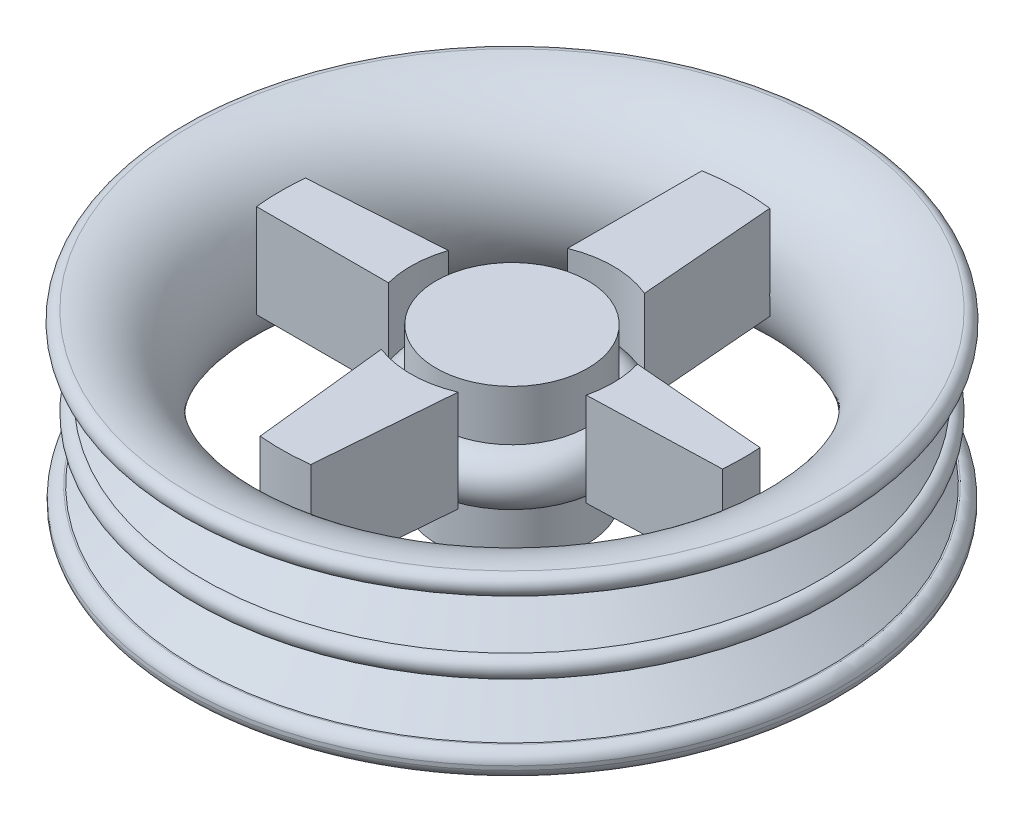
ISO-10303-21;
HEADER;
FILE_DESCRIPTION(('STEP AP214'),'2;1');
FILE_NAME('part.step','',(''),(''),'','','');
FILE_SCHEMA(('AUTOMOTIVE_DESIGN { 1 0 10303 214 1 1 1 1 }'));
ENDSEC;
DATA;
#1=APPLICATION_CONTEXT('core data for automotive mechanical design processes');
#2=APPLICATION_PROTOCOL_DEFINITION('international standard','automotive_design',2000,#1);
#3=PRODUCT_CONTEXT('',#1,'mechanical');
#4=PRODUCT('Part','Part','',(#3));
#5=PRODUCT_RELATED_PRODUCT_CATEGORY('part','',(#4));
#6=PRODUCT_DEFINITION_FORMATION('','',#4);
#7=PRODUCT_DEFINITION_CONTEXT('part definition',#1,'design');
#8=PRODUCT_DEFINITION('design','',#6,#7);
#9=PRODUCT_DEFINITION_SHAPE('','',#8);
#10=(LENGTH_UNIT() NAMED_UNIT(*) SI_UNIT(.MILLI.,.METRE.));
#11=(NAMED_UNIT(*) PLANE_ANGLE_UNIT() SI_UNIT($,.RADIAN.));
#12=(NAMED_UNIT(*) SI_UNIT($,.STERADIAN.) SOLID_ANGLE_UNIT());
#13=UNCERTAINTY_MEASURE_WITH_UNIT(LENGTH_MEASURE(1.E-05),#10,'distance_accuracy_value','');
#14=(GEOMETRIC_REPRESENTATION_CONTEXT(3) GLOBAL_UNCERTAINTY_ASSIGNED_CONTEXT((#13)) GLOBAL_UNIT_ASSIGNED_CONTEXT((#10,
#11,#12)) REPRESENTATION_CONTEXT('',''));
#15=CARTESIAN_POINT('',(0.,0.,0.));
#16=DIRECTION('',(0.,0.,1.));
#17=DIRECTION('',(1.,0.,0.));
#18=AXIS2_PLACEMENT_3D('',#15,#16,#17);
#19=CARTESIAN_POINT('',(0.,23.,0.));
#20=DIRECTION('',(0.,1.,0.));
#21=DIRECTION('',(0.,0.,1.));
#22=AXIS2_PLACEMENT_3D('',#19,#20,#21);
#23=CYLINDRICAL_SURFACE('',#22,91.4589113328219);
#24=CARTESIAN_POINT('',(0.,60.,0.));
#25=DIRECTION('',(0.,1.,0.));
#26=DIRECTION('',(0.,0.,1.));
#27=AXIS2_PLACEMENT_3D('',#24,#25,#26);
#28=CIRCLE('',#27,91.4589113328219);
#29=CARTESIAN_POINT('',(-90.9831737277375,60.,-9.31635983704523));
#30=VERTEX_POINT('',#29);
#31=CARTESIAN_POINT('',(-90.8946628008445,60.,10.1436056954988));
#32=VERTEX_POINT('',#31);
#33=EDGE_CURVE('E111',#30,#32,#28,.T.);
#34=ORIENTED_EDGE('',*,*,#33,.F.);
#35=DIRECTION('',(0.,1.,0.));
#36=VECTOR('',#35,1.);
#37=CARTESIAN_POINT('',(-90.9831737277375,23.,-9.31635983704523));
#38=LINE('',#37,#36);
#39=CARTESIAN_POINT('',(-90.9831737277375,23.,-9.31635983704523));
#40=VERTEX_POINT('',#39);
#41=EDGE_CURVE('E12',#40,#30,#38,.T.);
#42=ORIENTED_EDGE('',*,*,#41,.F.);
#43=CARTESIAN_POINT('',(0.,23.,0.));
#44=DIRECTION('',(0.,1.,0.));
#45=DIRECTION('',(0.,0.,1.));
#46=AXIS2_PLACEMENT_3D('',#43,#44,#45);
#47=CIRCLE('',#46,91.4589113328219);
#48=CARTESIAN_POINT('',(-90.8946628008445,23.,10.1436056954988));
#49=VERTEX_POINT('',#48);
#50=EDGE_CURVE('E106',#40,#49,#47,.T.);
#51=ORIENTED_EDGE('',*,*,#50,.T.);
#52=DIRECTION('',(0.,1.,0.));
#53=VECTOR('',#52,1.);
#54=CARTESIAN_POINT('',(-90.8946628008445,23.,10.1436056954988));
#55=LINE('',#54,#53);
#56=EDGE_CURVE('E49',#49,#32,#55,.T.);
#57=ORIENTED_EDGE('',*,*,#56,.T.);
#58=EDGE_LOOP('',(#34,#42,#51,#57));
#59=FACE_BOUND('',#58,.T.);
#60=ADVANCED_FACE('F46',(#59),#23,.T.);
#61=CARTESIAN_POINT('',(-90.9831737277375,23.,-9.31635983704523));
#62=DIRECTION('',(0.0648751614790877,0.,0.997893387804059));
#63=DIRECTION('',(0.997893387804059,0.,-0.0648751614790877));
#64=AXIS2_PLACEMENT_3D('',#61,#62,#63);
#65=PLANE('',#64);
#66=DIRECTION('',(0.997893387804059,0.,-0.0648751614790877));
#67=VECTOR('',#66,1.);
#68=CARTESIAN_POINT('',(-90.9831737277375,60.,-9.31635983704523));
#69=LINE('',#68,#67);
#70=CARTESIAN_POINT('',(-37.9078661653591,60.,-12.7668979313388));
#71=VERTEX_POINT('',#70);
#72=EDGE_CURVE('E79',#30,#71,#69,.T.);
#73=ORIENTED_EDGE('',*,*,#72,.T.);
#74=DIRECTION('',(0.,1.,0.));
#75=VECTOR('',#74,1.);
#76=CARTESIAN_POINT('',(-37.9078661653591,23.,-12.7668979313388));
#77=LINE('',#76,#75);
#78=CARTESIAN_POINT('',(-37.9078661653591,23.,-12.7668979313388));
#79=VERTEX_POINT('',#78);
#80=EDGE_CURVE('E55',#79,#71,#77,.T.);
#81=ORIENTED_EDGE('',*,*,#80,.F.);
#82=DIRECTION('',(0.997893387804059,0.,-0.0648751614790877));
#83=VECTOR('',#82,1.);
#84=CARTESIAN_POINT('',(-90.9831737277375,23.,-9.31635983704523));
#85=LINE('',#84,#83);
#86=EDGE_CURVE('E96',#40,#79,#85,.T.);
#87=ORIENTED_EDGE('',*,*,#86,.F.);
#88=ORIENTED_EDGE('',*,*,#41,.T.);
#89=EDGE_LOOP('',(#73,#81,#87,#88));
#90=FACE_BOUND('',#89,.T.);
#91=ADVANCED_FACE('F121',(#90),#65,.F.);
#92=CARTESIAN_POINT('',(0.,23.,0.));
#93=DIRECTION('',(0.,1.,0.));
#94=DIRECTION('',(0.,0.,1.));
#95=AXIS2_PLACEMENT_3D('',#92,#93,#94);
#96=CYLINDRICAL_SURFACE('',#95,40.);
#97=CARTESIAN_POINT('',(0.,60.,0.));
#98=DIRECTION('',(0.,1.,0.));
#99=DIRECTION('',(0.,0.,1.));
#100=AXIS2_PLACEMENT_3D('',#97,#98,#99);
#101=CIRCLE('',#100,40.);
#102=CARTESIAN_POINT('',(-38.6924703720794,60.,10.1436056954988));
#103=VERTEX_POINT('',#102);
#104=EDGE_CURVE('E103',#71,#103,#101,.T.);
#105=ORIENTED_EDGE('',*,*,#104,.T.);
#106=DIRECTION('',(0.,1.,0.));
#107=VECTOR('',#106,1.);
#108=CARTESIAN_POINT('',(-38.6924703720794,23.,10.1436056954988));
#109=LINE('',#108,#107);
#110=CARTESIAN_POINT('',(-38.6924703720794,23.,10.1436056954988));
#111=VERTEX_POINT('',#110);
#112=EDGE_CURVE('E100',#111,#103,#109,.T.);
#113=ORIENTED_EDGE('',*,*,#112,.F.);
#114=CARTESIAN_POINT('',(0.,23.,0.));
#115=DIRECTION('',(0.,1.,0.));
#116=DIRECTION('',(0.,0.,1.));
#117=AXIS2_PLACEMENT_3D('',#114,#115,#116);
#118=CIRCLE('',#117,40.);
#119=EDGE_CURVE('E91',#79,#111,#118,.T.);
#120=ORIENTED_EDGE('',*,*,#119,.F.);
#121=ORIENTED_EDGE('',*,*,#80,.T.);
#122=EDGE_LOOP('',(#105,#113,#120,#121));
#123=FACE_BOUND('',#122,.T.);
#124=ADVANCED_FACE('F101',(#123),#96,.F.);
#125=CARTESIAN_POINT('',(-90.8946628008445,23.,10.1436056954988));
#126=DIRECTION('',(0.,0.,1.));
#127=DIRECTION('',(1.,0.,0.));
#128=AXIS2_PLACEMENT_3D('',#125,#126,#127);
#129=PLANE('',#128);
#130=DIRECTION('',(1.,0.,0.));
#131=VECTOR('',#130,1.);
#132=CARTESIAN_POINT('',(-90.8946628008445,60.,10.1436056954988));
#133=LINE('',#132,#131);
#134=EDGE_CURVE('E114',#32,#103,#133,.T.);
#135=ORIENTED_EDGE('',*,*,#134,.F.);
#136=ORIENTED_EDGE('',*,*,#56,.F.);
#137=DIRECTION('',(1.,0.,0.));
#138=VECTOR('',#137,1.);
#139=CARTESIAN_POINT('',(-90.8946628008445,23.,10.1436056954988));
#140=LINE('',#139,#138);
#141=EDGE_CURVE('E95',#49,#111,#140,.T.);
#142=ORIENTED_EDGE('',*,*,#141,.T.);
#143=ORIENTED_EDGE('',*,*,#112,.T.);
#144=EDGE_LOOP('',(#135,#136,#142,#143));
#145=FACE_BOUND('',#144,.T.);
#146=ADVANCED_FACE('F105',(#145),#129,.T.);
#147=CARTESIAN_POINT('',(0.,23.,0.));
#148=DIRECTION('',(0.,1.,0.));
#149=DIRECTION('',(0.,0.,1.));
#150=AXIS2_PLACEMENT_3D('',#147,#148,#149);
#151=PLANE('',#150);
#152=ORIENTED_EDGE('',*,*,#50,.F.);
#153=ORIENTED_EDGE('',*,*,#86,.T.);
#154=ORIENTED_EDGE('',*,*,#119,.T.);
#155=ORIENTED_EDGE('',*,*,#141,.F.);
#156=EDGE_LOOP('',(#152,#153,#154,#155));
#157=FACE_BOUND('',#156,.T.);
#158=ADVANCED_FACE('F94',(#157),#151,.F.);
#159=CARTESIAN_POINT('',(0.,60.,0.));
#160=DIRECTION('',(0.,1.,0.));
#161=DIRECTION('',(0.,0.,1.));
#162=AXIS2_PLACEMENT_3D('',#159,#160,#161);
#163=PLANE('',#162);
#164=ORIENTED_EDGE('',*,*,#33,.T.);
#165=ORIENTED_EDGE('',*,*,#134,.T.);
#166=ORIENTED_EDGE('',*,*,#104,.F.);
#167=ORIENTED_EDGE('',*,*,#72,.F.);
#168=EDGE_LOOP('',(#164,#165,#166,#167));
#169=FACE_BOUND('',#168,.T.);
#170=ADVANCED_FACE('F119',(#169),#163,.T.);
#171=CLOSED_SHELL('',(#60,#91,#124,#146,#158,#170));
#172=MANIFOLD_SOLID_BREP('B2',#171);
#173=CARTESIAN_POINT('',(38.3931390808547,23.,-11.2234964034452));
#174=DIRECTION('',(-0.0820911920243517,0.,0.996624822183363));
#175=DIRECTION('',(0.996624822183364,0.,0.0820911920243518));
#176=AXIS2_PLACEMENT_3D('',#173,#174,#175);
#177=PLANE('',#176);
#178=DIRECTION('',(0.996624822183364,0.,0.0820911920243517));
#179=VECTOR('',#178,1.);
#180=CARTESIAN_POINT('',(38.3931390808547,60.,-11.2234964034452));
#181=LINE('',#180,#179);
#182=CARTESIAN_POINT('',(38.3931390808547,60.,-11.2234964034452));
#183=VERTEX_POINT('',#182);
#184=CARTESIAN_POINT('',(91.2002362359535,60.,-6.87381791228454));
#185=VERTEX_POINT('',#184);
#186=EDGE_CURVE('E242',#183,#185,#181,.T.);
#187=ORIENTED_EDGE('',*,*,#186,.T.);
#188=DIRECTION('',(0.,1.,0.));
#189=VECTOR('',#188,1.);
#190=CARTESIAN_POINT('',(91.2002362359535,23.,-6.87381791228454));
#191=LINE('',#190,#189);
#192=CARTESIAN_POINT('',(91.2002362359535,23.,-6.87381791228454));
#193=VERTEX_POINT('',#192);
#194=EDGE_CURVE('E44',#193,#185,#191,.T.);
#195=ORIENTED_EDGE('',*,*,#194,.F.);
#196=DIRECTION('',(0.996624822183364,0.,0.0820911920243517));
#197=VECTOR('',#196,1.);
#198=CARTESIAN_POINT('',(38.3931390808547,23.,-11.2234964034452));
#199=LINE('',#198,#197);
#200=CARTESIAN_POINT('',(38.3931390808547,23.,-11.2234964034452));
#201=VERTEX_POINT('',#200);
#202=EDGE_CURVE('E219',#201,#193,#199,.T.);
#203=ORIENTED_EDGE('',*,*,#202,.F.);
#204=DIRECTION('',(0.,1.,0.));
#205=VECTOR('',#204,1.);
#206=CARTESIAN_POINT('',(38.3931390808547,23.,-11.2234964034452));
#207=LINE('',#206,#205);
#208=EDGE_CURVE('E238',#201,#183,#207,.T.);
#209=ORIENTED_EDGE('',*,*,#208,.T.);
#210=EDGE_LOOP('',(#187,#195,#203,#209));
#211=FACE_BOUND('',#210,.T.);
#212=ADVANCED_FACE('F180',(#211),#177,.F.);
#213=CARTESIAN_POINT('',(0.,23.,0.));
#214=DIRECTION('',(0.,1.,0.));
#215=DIRECTION('',(0.,0.,1.));
#216=AXIS2_PLACEMENT_3D('',#213,#214,#215);
#217=CYLINDRICAL_SURFACE('',#216,91.4589113328219);
#218=CARTESIAN_POINT('',(0.,60.,0.));
#219=DIRECTION('',(0.,1.,0.));
#220=DIRECTION('',(0.,0.,1.));
#221=AXIS2_PLACEMENT_3D('',#218,#219,#220);
#222=CIRCLE('',#221,91.4589113328219);
#223=CARTESIAN_POINT('',(91.118189276814,60.,7.88720768711422));
#224=VERTEX_POINT('',#223);
#225=EDGE_CURVE('E228',#224,#185,#222,.T.);
#226=ORIENTED_EDGE('',*,*,#225,.F.);
#227=DIRECTION('',(0.,1.,0.));
#228=VECTOR('',#227,1.);
#229=CARTESIAN_POINT('',(91.118189276814,23.,7.88720768711422));
#230=LINE('',#229,#228);
#231=CARTESIAN_POINT('',(91.118189276814,23.,7.88720768711422));
#232=VERTEX_POINT('',#231);
#233=EDGE_CURVE('E188',#232,#224,#230,.T.);
#234=ORIENTED_EDGE('',*,*,#233,.F.);
#235=CARTESIAN_POINT('',(0.,23.,0.));
#236=DIRECTION('',(0.,1.,0.));
#237=DIRECTION('',(0.,0.,1.));
#238=AXIS2_PLACEMENT_3D('',#235,#236,#237);
#239=CIRCLE('',#238,91.4589113328219);
#240=EDGE_CURVE('E226',#232,#193,#239,.T.);
#241=ORIENTED_EDGE('',*,*,#240,.T.);
#242=ORIENTED_EDGE('',*,*,#194,.T.);
#243=EDGE_LOOP('',(#226,#234,#241,#242));
#244=FACE_BOUND('',#243,.T.);
#245=ADVANCED_FACE('F225',(#244),#217,.T.);
#246=CARTESIAN_POINT('',(38.8508563746418,23.,9.51897888205195));
#247=DIRECTION('',(0.0312045108396659,0.,0.999513020677198));
#248=DIRECTION('',(0.999513020677198,0.,-0.0312045108396659));
#249=AXIS2_PLACEMENT_3D('',#246,#247,#248);
#250=PLANE('',#249);
#251=DIRECTION('',(0.999513020677198,0.,-0.0312045108396659));
#252=VECTOR('',#251,1.);
#253=CARTESIAN_POINT('',(38.8508563746418,60.,9.51897888205195));
#254=LINE('',#253,#252);
#255=CARTESIAN_POINT('',(38.8508563746418,60.,9.51897888205195));
#256=VERTEX_POINT('',#255);
#257=EDGE_CURVE('E246',#256,#224,#254,.T.);
#258=ORIENTED_EDGE('',*,*,#257,.F.);
#259=DIRECTION('',(0.,1.,0.));
#260=VECTOR('',#259,1.);
#261=CARTESIAN_POINT('',(38.8508563746418,23.,9.51897888205195));
#262=LINE('',#261,#260);
#263=CARTESIAN_POINT('',(38.8508563746418,23.,9.51897888205195));
#264=VERTEX_POINT('',#263);
#265=EDGE_CURVE('E211',#264,#256,#262,.T.);
#266=ORIENTED_EDGE('',*,*,#265,.F.);
#267=DIRECTION('',(0.999513020677198,0.,-0.0312045108396659));
#268=VECTOR('',#267,1.);
#269=CARTESIAN_POINT('',(38.8508563746418,23.,9.51897888205195));
#270=LINE('',#269,#268);
#271=EDGE_CURVE('E234',#264,#232,#270,.T.);
#272=ORIENTED_EDGE('',*,*,#271,.T.);
#273=ORIENTED_EDGE('',*,*,#233,.T.);
#274=EDGE_LOOP('',(#258,#266,#272,#273));
#275=FACE_BOUND('',#274,.T.);
#276=ADVANCED_FACE('F236',(#275),#250,.T.);
#277=CARTESIAN_POINT('',(0.,23.,0.));
#278=DIRECTION('',(0.,1.,0.));
#279=DIRECTION('',(0.,0.,1.));
#280=AXIS2_PLACEMENT_3D('',#277,#278,#279);
#281=CYLINDRICAL_SURFACE('',#280,40.);
#282=CARTESIAN_POINT('',(0.,60.,0.));
#283=DIRECTION('',(0.,1.,0.));
#284=DIRECTION('',(0.,0.,1.));
#285=AXIS2_PLACEMENT_3D('',#282,#283,#284);
#286=CIRCLE('',#285,40.);
#287=EDGE_CURVE('E214',#256,#183,#286,.T.);
#288=ORIENTED_EDGE('',*,*,#287,.T.);
#289=ORIENTED_EDGE('',*,*,#208,.F.);
#290=CARTESIAN_POINT('',(0.,23.,0.));
#291=DIRECTION('',(0.,1.,0.));
#292=DIRECTION('',(0.,0.,1.));
#293=AXIS2_PLACEMENT_3D('',#290,#291,#292);
#294=CIRCLE('',#293,40.);
#295=EDGE_CURVE('E196',#264,#201,#294,.T.);
#296=ORIENTED_EDGE('',*,*,#295,.F.);
#297=ORIENTED_EDGE('',*,*,#265,.T.);
#298=EDGE_LOOP('',(#288,#289,#296,#297));
#299=FACE_BOUND('',#298,.T.);
#300=ADVANCED_FACE('F259',(#299),#281,.F.);
#301=CARTESIAN_POINT('',(0.,23.,0.));
#302=DIRECTION('',(0.,1.,0.));
#303=DIRECTION('',(0.,0.,1.));
#304=AXIS2_PLACEMENT_3D('',#301,#302,#303);
#305=PLANE('',#304);
#306=ORIENTED_EDGE('',*,*,#202,.T.);
#307=ORIENTED_EDGE('',*,*,#240,.F.);
#308=ORIENTED_EDGE('',*,*,#271,.F.);
#309=ORIENTED_EDGE('',*,*,#295,.T.);
#310=EDGE_LOOP('',(#306,#307,#308,#309));
#311=FACE_BOUND('',#310,.T.);
#312=ADVANCED_FACE('F233',(#311),#305,.F.);
#313=CARTESIAN_POINT('',(0.,60.,0.));
#314=DIRECTION('',(0.,1.,0.));
#315=DIRECTION('',(0.,0.,1.));
#316=AXIS2_PLACEMENT_3D('',#313,#314,#315);
#317=PLANE('',#316);
#318=ORIENTED_EDGE('',*,*,#186,.F.);
#319=ORIENTED_EDGE('',*,*,#287,.F.);
#320=ORIENTED_EDGE('',*,*,#257,.T.);
#321=ORIENTED_EDGE('',*,*,#225,.T.);
#322=EDGE_LOOP('',(#318,#319,#320,#321));
#323=FACE_BOUND('',#322,.T.);
#324=ADVANCED_FACE('F253',(#323),#317,.T.);
#325=CLOSED_SHELL('',(#212,#245,#276,#300,#312,#324));
#326=MANIFOLD_SOLID_BREP('B6',#325);
#327=CARTESIAN_POINT('',(0.,63.,0.));
#328=DIRECTION('',(0.,-1.,0.));
#329=DIRECTION('',(0.,0.,-1.));
#330=AXIS2_PLACEMENT_3D('',#327,#328,#329);
#331=CYLINDRICAL_SURFACE('',#330,40.);
#332=DIRECTION('',(0.,-1.,0.));
#333=VECTOR('',#332,1.);
#334=CARTESIAN_POINT('',(15.5278062635002,63.,36.8630876710457));
#335=LINE('',#334,#333);
#336=CARTESIAN_POINT('',(15.5278062635002,63.,36.8630876710457));
#337=VERTEX_POINT('',#336);
#338=CARTESIAN_POINT('',(15.5278062635002,23.,36.8630876710457));
#339=VERTEX_POINT('',#338);
#340=EDGE_CURVE('E317',#337,#339,#335,.T.);
#341=ORIENTED_EDGE('',*,*,#340,.T.);
#342=CARTESIAN_POINT('',(0.,23.,0.));
#343=DIRECTION('',(0.,1.,0.));
#344=DIRECTION('',(0.,0.,1.));
#345=AXIS2_PLACEMENT_3D('',#342,#343,#344);
#346=CIRCLE('',#345,40.);
#347=CARTESIAN_POINT('',(-14.341098737347,23.,37.3407670918216));
#348=VERTEX_POINT('',#347);
#349=EDGE_CURVE('E354',#348,#339,#346,.T.);
#350=ORIENTED_EDGE('',*,*,#349,.F.);
#351=DIRECTION('',(0.,-1.,0.));
#352=VECTOR('',#351,1.);
#353=CARTESIAN_POINT('',(-14.341098737347,63.,37.3407670918216));
#354=LINE('',#353,#352);
#355=CARTESIAN_POINT('',(-14.341098737347,63.,37.3407670918216));
#356=VERTEX_POINT('',#355);
#357=EDGE_CURVE('E178',#356,#348,#354,.T.);
#358=ORIENTED_EDGE('',*,*,#357,.F.);
#359=CARTESIAN_POINT('',(0.,63.,0.));
#360=DIRECTION('',(0.,1.,0.));
#361=DIRECTION('',(0.,0.,1.));
#362=AXIS2_PLACEMENT_3D('',#359,#360,#361);
#363=CIRCLE('',#362,40.);
#364=EDGE_CURVE('E356',#356,#337,#363,.T.);
#365=ORIENTED_EDGE('',*,*,#364,.T.);
#366=EDGE_LOOP('',(#341,#350,#358,#365));
#367=FACE_BOUND('',#366,.T.);
#368=ADVANCED_FACE('F314',(#367),#331,.F.);
#369=CARTESIAN_POINT('',(-14.341098737347,63.,37.3407670918216));
#370=DIRECTION('',(0.994229006561783,0.,-0.107278527726524));
#371=DIRECTION('',(-0.107278527726524,0.,-0.994229006561783));
#372=AXIS2_PLACEMENT_3D('',#369,#370,#371);
#373=PLANE('',#372);
#374=ORIENTED_EDGE('',*,*,#357,.T.);
#375=DIRECTION('',(0.107278527726524,0.,0.994229006561783));
#376=VECTOR('',#375,1.);
#377=CARTESIAN_POINT('',(-14.341098737347,23.,37.3407670918216));
#378=LINE('',#377,#376);
#379=CARTESIAN_POINT('',(-8.54484950903178,23.,91.0588711167285));
#380=VERTEX_POINT('',#379);
#381=EDGE_CURVE('E372',#348,#380,#378,.T.);
#382=ORIENTED_EDGE('',*,*,#381,.T.);
#383=DIRECTION('',(0.,-1.,0.));
#384=VECTOR('',#383,1.);
#385=CARTESIAN_POINT('',(-8.54484950903178,63.,91.0588711167285));
#386=LINE('',#385,#384);
#387=CARTESIAN_POINT('',(-8.54484950903178,63.,91.0588711167285));
#388=VERTEX_POINT('',#387);
#389=EDGE_CURVE('E322',#388,#380,#386,.T.);
#390=ORIENTED_EDGE('',*,*,#389,.F.);
#391=DIRECTION('',(0.107278527726524,0.,0.994229006561783));
#392=VECTOR('',#391,1.);
#393=CARTESIAN_POINT('',(-14.341098737347,63.,37.3407670918216));
#394=LINE('',#393,#392);
#395=EDGE_CURVE('E335',#356,#388,#394,.T.);
#396=ORIENTED_EDGE('',*,*,#395,.F.);
#397=EDGE_LOOP('',(#374,#382,#390,#396));
#398=FACE_BOUND('',#397,.T.);
#399=ADVANCED_FACE('F387',(#398),#373,.F.);
#400=CARTESIAN_POINT('',(0.,63.,0.));
#401=DIRECTION('',(0.,-1.,0.));
#402=DIRECTION('',(0.,0.,-1.));
#403=AXIS2_PLACEMENT_3D('',#400,#401,#402);
#404=CYLINDRICAL_SURFACE('',#403,91.4589113328219);
#405=ORIENTED_EDGE('',*,*,#389,.T.);
#406=CARTESIAN_POINT('',(0.,23.,0.));
#407=DIRECTION('',(0.,1.,0.));
#408=DIRECTION('',(0.,0.,1.));
#409=AXIS2_PLACEMENT_3D('',#406,#407,#408);
#410=CIRCLE('',#409,91.4589113328219);
#411=CARTESIAN_POINT('',(11.1882063196708,23.,90.7720028507329));
#412=VERTEX_POINT('',#411);
#413=EDGE_CURVE('E368',#380,#412,#410,.T.);
#414=ORIENTED_EDGE('',*,*,#413,.T.);
#415=DIRECTION('',(0.,-1.,0.));
#416=VECTOR('',#415,1.);
#417=CARTESIAN_POINT('',(11.1882063196708,63.,90.7720028507329));
#418=LINE('',#417,#416);
#419=CARTESIAN_POINT('',(11.1882063196708,63.,90.7720028507329));
#420=VERTEX_POINT('',#419);
#421=EDGE_CURVE('E360',#420,#412,#418,.T.);
#422=ORIENTED_EDGE('',*,*,#421,.F.);
#423=CARTESIAN_POINT('',(0.,63.,0.));
#424=DIRECTION('',(0.,1.,0.));
#425=DIRECTION('',(0.,0.,1.));
#426=AXIS2_PLACEMENT_3D('',#423,#424,#425);
#427=CIRCLE('',#426,91.4589113328219);
#428=EDGE_CURVE('E380',#388,#420,#427,.T.);
#429=ORIENTED_EDGE('',*,*,#428,.F.);
#430=EDGE_LOOP('',(#405,#414,#422,#429));
#431=FACE_BOUND('',#430,.T.);
#432=ADVANCED_FACE('F385',(#431),#404,.T.);
#433=CARTESIAN_POINT('',(15.5278062635002,63.,36.8630876710457));
#434=DIRECTION('',(0.996775638213766,0.,0.0802391865832404));
#435=DIRECTION('',(0.0802391865832404,0.,-0.996775638213766));
#436=AXIS2_PLACEMENT_3D('',#433,#434,#435);
#437=PLANE('',#436);
#438=ORIENTED_EDGE('',*,*,#421,.T.);
#439=DIRECTION('',(-0.0802391865832404,0.,0.996775638213766));
#440=VECTOR('',#439,1.);
#441=CARTESIAN_POINT('',(15.5278062635002,23.,36.8630876710457));
#442=LINE('',#441,#440);
#443=EDGE_CURVE('E362',#339,#412,#442,.T.);
#444=ORIENTED_EDGE('',*,*,#443,.F.);
#445=ORIENTED_EDGE('',*,*,#340,.F.);
#446=DIRECTION('',(-0.0802391865832404,0.,0.996775638213766));
#447=VECTOR('',#446,1.);
#448=CARTESIAN_POINT('',(15.5278062635002,63.,36.8630876710457));
#449=LINE('',#448,#447);
#450=EDGE_CURVE('E378',#337,#420,#449,.T.);
#451=ORIENTED_EDGE('',*,*,#450,.T.);
#452=EDGE_LOOP('',(#438,#444,#445,#451));
#453=FACE_BOUND('',#452,.T.);
#454=ADVANCED_FACE('F363',(#453),#437,.T.);
#455=CARTESIAN_POINT('',(0.,63.,0.));
#456=DIRECTION('',(0.,1.,0.));
#457=DIRECTION('',(0.,0.,1.));
#458=AXIS2_PLACEMENT_3D('',#455,#456,#457);
#459=PLANE('',#458);
#460=ORIENTED_EDGE('',*,*,#364,.F.);
#461=ORIENTED_EDGE('',*,*,#395,.T.);
#462=ORIENTED_EDGE('',*,*,#428,.T.);
#463=ORIENTED_EDGE('',*,*,#450,.F.);
#464=EDGE_LOOP('',(#460,#461,#462,#463));
#465=FACE_BOUND('',#464,.T.);
#466=ADVANCED_FACE('F388',(#465),#459,.T.);
#467=CARTESIAN_POINT('',(0.,23.,0.));
#468=DIRECTION('',(0.,1.,0.));
#469=DIRECTION('',(0.,0.,1.));
#470=AXIS2_PLACEMENT_3D('',#467,#468,#469);
#471=PLANE('',#470);
#472=ORIENTED_EDGE('',*,*,#349,.T.);
#473=ORIENTED_EDGE('',*,*,#443,.T.);
#474=ORIENTED_EDGE('',*,*,#413,.F.);
#475=ORIENTED_EDGE('',*,*,#381,.F.);
#476=EDGE_LOOP('',(#472,#473,#474,#475));
#477=FACE_BOUND('',#476,.T.);
#478=ADVANCED_FACE('F370',(#477),#471,.F.);
#479=CLOSED_SHELL('',(#368,#399,#432,#454,#466,#478));
#480=MANIFOLD_SOLID_BREP('B38',#479);
#481=CARTESIAN_POINT('',(0.,23.,0.));
#482=DIRECTION('',(0.,1.,0.));
#483=DIRECTION('',(0.,0.,1.));
#484=AXIS2_PLACEMENT_3D('',#481,#482,#483);
#485=CYLINDRICAL_SURFACE('',#484,91.4589113328219);
#486=CARTESIAN_POINT('',(0.,60.,0.));
#487=DIRECTION('',(0.,1.,0.));
#488=DIRECTION('',(0.,0.,1.));
#489=AXIS2_PLACEMENT_3D('',#486,#487,#488);
#490=CIRCLE('',#489,91.4589113328219);
#491=CARTESIAN_POINT('',(11.1974554615913,60.,-90.7708623588575));
#492=VERTEX_POINT('',#491);
#493=CARTESIAN_POINT('',(-15.0790774994031,60.,-90.2072828764505));
#494=VERTEX_POINT('',#493);
#495=EDGE_CURVE('E511',#492,#494,#490,.T.);
#496=ORIENTED_EDGE('',*,*,#495,.F.);
#497=DIRECTION('',(0.,1.,0.));
#498=VECTOR('',#497,1.);
#499=CARTESIAN_POINT('',(11.1974554615913,23.,-90.7708623588575));
#500=LINE('',#499,#498);
#501=CARTESIAN_POINT('',(11.1974554615913,23.,-90.7708623588575));
#502=VERTEX_POINT('',#501);
#503=EDGE_CURVE('E312',#502,#492,#500,.T.);
#504=ORIENTED_EDGE('',*,*,#503,.F.);
#505=CARTESIAN_POINT('',(0.,23.,0.));
#506=DIRECTION('',(0.,1.,0.));
#507=DIRECTION('',(0.,0.,1.));
#508=AXIS2_PLACEMENT_3D('',#505,#506,#507);
#509=CIRCLE('',#508,91.4589113328219);
#510=CARTESIAN_POINT('',(-15.0790774994031,23.,-90.2072828764505));
#511=VERTEX_POINT('',#510);
#512=EDGE_CURVE('E506',#502,#511,#509,.T.);
#513=ORIENTED_EDGE('',*,*,#512,.T.);
#514=DIRECTION('',(0.,1.,0.));
#515=VECTOR('',#514,1.);
#516=CARTESIAN_POINT('',(-15.0790774994031,23.,-90.2072828764505));
#517=LINE('',#516,#515);
#518=EDGE_CURVE('E449',#511,#494,#517,.T.);
#519=ORIENTED_EDGE('',*,*,#518,.T.);
#520=EDGE_LOOP('',(#496,#504,#513,#519));
#521=FACE_BOUND('',#520,.T.);
#522=ADVANCED_FACE('F446',(#521),#485,.T.);
#523=CARTESIAN_POINT('',(11.1974554615913,23.,-90.7708623588575));
#524=DIRECTION('',(-0.996789166704746,0.,0.0800709506628905));
#525=DIRECTION('',(0.0800709506628905,0.,0.996789166704746));
#526=AXIS2_PLACEMENT_3D('',#523,#524,#525);
#527=PLANE('',#526);
#528=DIRECTION('',(0.0800709506628905,0.,0.996789166704745));
#529=VECTOR('',#528,1.);
#530=CARTESIAN_POINT('',(11.1974554615913,60.,-90.7708623588575));
#531=LINE('',#530,#529);
#532=CARTESIAN_POINT('',(15.5278062635002,60.,-36.8630876710457));
#533=VERTEX_POINT('',#532);
#534=EDGE_CURVE('E479',#492,#533,#531,.T.);
#535=ORIENTED_EDGE('',*,*,#534,.T.);
#536=DIRECTION('',(0.,1.,0.));
#537=VECTOR('',#536,1.);
#538=CARTESIAN_POINT('',(15.5278062635002,23.,-36.8630876710457));
#539=LINE('',#538,#537);
#540=CARTESIAN_POINT('',(15.5278062635002,23.,-36.8630876710457));
#541=VERTEX_POINT('',#540);
#542=EDGE_CURVE('E455',#541,#533,#539,.T.);
#543=ORIENTED_EDGE('',*,*,#542,.F.);
#544=DIRECTION('',(0.0800709506628905,0.,0.996789166704745));
#545=VECTOR('',#544,1.);
#546=CARTESIAN_POINT('',(11.1974554615913,23.,-90.7708623588575));
#547=LINE('',#546,#545);
#548=EDGE_CURVE('E496',#502,#541,#547,.T.);
#549=ORIENTED_EDGE('',*,*,#548,.F.);
#550=ORIENTED_EDGE('',*,*,#503,.T.);
#551=EDGE_LOOP('',(#535,#543,#549,#550));
#552=FACE_BOUND('',#551,.T.);
#553=ADVANCED_FACE('F521',(#552),#527,.F.);
#554=CARTESIAN_POINT('',(0.,23.,0.));
#555=DIRECTION('',(0.,1.,0.));
#556=DIRECTION('',(0.,0.,1.));
#557=AXIS2_PLACEMENT_3D('',#554,#555,#556);
#558=CYLINDRICAL_SURFACE('',#557,40.);
#559=CARTESIAN_POINT('',(0.,60.,0.));
#560=DIRECTION('',(0.,1.,0.));
#561=DIRECTION('',(0.,0.,1.));
#562=AXIS2_PLACEMENT_3D('',#559,#560,#561);
#563=CIRCLE('',#562,40.);
#564=CARTESIAN_POINT('',(-15.0790774994031,60.,-37.0489058106578));
#565=VERTEX_POINT('',#564);
#566=EDGE_CURVE('E503',#533,#565,#563,.T.);
#567=ORIENTED_EDGE('',*,*,#566,.T.);
#568=DIRECTION('',(0.,1.,0.));
#569=VECTOR('',#568,1.);
#570=CARTESIAN_POINT('',(-15.0790774994031,23.,-37.0489058106578));
#571=LINE('',#570,#569);
#572=CARTESIAN_POINT('',(-15.0790774994031,23.,-37.0489058106578));
#573=VERTEX_POINT('',#572);
#574=EDGE_CURVE('E500',#573,#565,#571,.T.);
#575=ORIENTED_EDGE('',*,*,#574,.F.);
#576=CARTESIAN_POINT('',(0.,23.,0.));
#577=DIRECTION('',(0.,1.,0.));
#578=DIRECTION('',(0.,0.,1.));
#579=AXIS2_PLACEMENT_3D('',#576,#577,#578);
#580=CIRCLE('',#579,40.);
#581=EDGE_CURVE('E491',#541,#573,#580,.T.);
#582=ORIENTED_EDGE('',*,*,#581,.F.);
#583=ORIENTED_EDGE('',*,*,#542,.T.);
#584=EDGE_LOOP('',(#567,#575,#582,#583));
#585=FACE_BOUND('',#584,.T.);
#586=ADVANCED_FACE('F501',(#585),#558,.F.);
#587=CARTESIAN_POINT('',(-15.0790774994031,23.,-90.2072828764505));
#588=DIRECTION('',(-1.,0.,0.));
#589=DIRECTION('',(0.,0.,1.));
#590=AXIS2_PLACEMENT_3D('',#587,#588,#589);
#591=PLANE('',#590);
#592=DIRECTION('',(0.,0.,1.));
#593=VECTOR('',#592,1.);
#594=CARTESIAN_POINT('',(-15.0790774994031,60.,-90.2072828764505));
#595=LINE('',#594,#593);
#596=EDGE_CURVE('E514',#494,#565,#595,.T.);
#597=ORIENTED_EDGE('',*,*,#596,.F.);
#598=ORIENTED_EDGE('',*,*,#518,.F.);
#599=DIRECTION('',(0.,0.,1.));
#600=VECTOR('',#599,1.);
#601=CARTESIAN_POINT('',(-15.0790774994031,23.,-90.2072828764505));
#602=LINE('',#601,#600);
#603=EDGE_CURVE('E495',#511,#573,#602,.T.);
#604=ORIENTED_EDGE('',*,*,#603,.T.);
#605=ORIENTED_EDGE('',*,*,#574,.T.);
#606=EDGE_LOOP('',(#597,#598,#604,#605));
#607=FACE_BOUND('',#606,.T.);
#608=ADVANCED_FACE('F505',(#607),#591,.T.);
#609=CARTESIAN_POINT('',(0.,23.,0.));
#610=DIRECTION('',(0.,1.,0.));
#611=DIRECTION('',(0.,0.,1.));
#612=AXIS2_PLACEMENT_3D('',#609,#610,#611);
#613=PLANE('',#612);
#614=ORIENTED_EDGE('',*,*,#512,.F.);
#615=ORIENTED_EDGE('',*,*,#548,.T.);
#616=ORIENTED_EDGE('',*,*,#581,.T.);
#617=ORIENTED_EDGE('',*,*,#603,.F.);
#618=EDGE_LOOP('',(#614,#615,#616,#617));
#619=FACE_BOUND('',#618,.T.);
#620=ADVANCED_FACE('F494',(#619),#613,.F.);
#621=CARTESIAN_POINT('',(0.,60.,0.));
#622=DIRECTION('',(0.,1.,0.));
#623=DIRECTION('',(0.,0.,1.));
#624=AXIS2_PLACEMENT_3D('',#621,#622,#623);
#625=PLANE('',#624);
#626=ORIENTED_EDGE('',*,*,#495,.T.);
#627=ORIENTED_EDGE('',*,*,#596,.T.);
#628=ORIENTED_EDGE('',*,*,#566,.F.);
#629=ORIENTED_EDGE('',*,*,#534,.F.);
#630=EDGE_LOOP('',(#626,#627,#628,#629));
#631=FACE_BOUND('',#630,.T.);
#632=ADVANCED_FACE('F519',(#631),#625,.T.);
#633=CLOSED_SHELL('',(#522,#553,#586,#608,#620,#632));
#634=MANIFOLD_SOLID_BREP('B172',#633);
#635=CARTESIAN_POINT('',(0.,17.2770453350116,0.));
#636=DIRECTION('',(0.,1.,0.));
#637=DIRECTION('',(0.,0.,1.));
#638=AXIS2_PLACEMENT_3D('',#635,#636,#637);
#639=CONICAL_SURFACE('',#638,109.175592252113,0.989736070048775);
#640=CARTESIAN_POINT('',(0.,26.,0.));
#641=DIRECTION('',(0.,-1.,0.));
#642=DIRECTION('',(0.,0.,-1.));
#643=AXIS2_PLACEMENT_3D('',#640,#641,#642);
#644=CIRCLE('',#643,122.458911332822);
#645=CARTESIAN_POINT('',(0.,26.,-122.458911332822));
#646=VERTEX_POINT('',#645);
#647=EDGE_CURVE('E445',#646,#646,#644,.T.);
#648=ORIENTED_EDGE('',*,*,#647,.T.);
#649=EDGE_LOOP('',(#648));
#650=FACE_BOUND('',#649,.T.);
#651=CARTESIAN_POINT('',(0.,17.2770453350116,0.));
#652=DIRECTION('',(0.,-1.,0.));
#653=DIRECTION('',(0.,0.,-1.));
#654=AXIS2_PLACEMENT_3D('',#651,#652,#653);
#655=CIRCLE('',#654,109.175592252113);
#656=CARTESIAN_POINT('',(0.,17.2770453350116,-109.175592252113));
#657=VERTEX_POINT('',#656);
#658=EDGE_CURVE('E614',#657,#657,#655,.T.);
#659=ORIENTED_EDGE('',*,*,#658,.F.);
#660=EDGE_LOOP('',(#659));
#661=FACE_BOUND('',#660,.T.);
#662=ADVANCED_FACE('F577',(#650,#661),#639,.T.);
#663=CARTESIAN_POINT('',(0.,30.,0.));
#664=DIRECTION('',(0.,-1.,0.));
#665=DIRECTION('',(0.,0.,-1.));
#666=AXIS2_PLACEMENT_3D('',#663,#664,#665);
#667=TOROIDAL_SURFACE('',#666,122.458911332822,3.99999999999999);
#668=CARTESIAN_POINT('',(0.,34.,0.));
#669=DIRECTION('',(0.,-1.,0.));
#670=DIRECTION('',(0.,0.,-1.));
#671=AXIS2_PLACEMENT_3D('',#668,#669,#670);
#672=CIRCLE('',#671,122.458911332822);
#673=CARTESIAN_POINT('',(0.,34.,-122.458911332822));
#674=VERTEX_POINT('',#673);
#675=EDGE_CURVE('E583',#674,#674,#672,.T.);
#676=ORIENTED_EDGE('',*,*,#675,.T.);
#677=EDGE_LOOP('',(#676));
#678=FACE_BOUND('',#677,.T.);
#679=ORIENTED_EDGE('',*,*,#647,.F.);
#680=EDGE_LOOP('',(#679));
#681=FACE_BOUND('',#680,.T.);
#682=ADVANCED_FACE('F621',(#678,#681),#667,.T.);
#683=CARTESIAN_POINT('',(0.,46.2150088465723,0.));
#684=DIRECTION('',(0.,-1.,0.));
#685=DIRECTION('',(0.,0.,-1.));
#686=AXIS2_PLACEMENT_3D('',#683,#684,#685);
#687=CONICAL_SURFACE('',#686,109.175592252113,0.827270940216116);
#688=ORIENTED_EDGE('',*,*,#675,.F.);
#689=EDGE_LOOP('',(#688));
#690=FACE_BOUND('',#689,.T.);
#691=CARTESIAN_POINT('',(0.,46.2150088465723,0.));
#692=DIRECTION('',(0.,-1.,0.));
#693=DIRECTION('',(0.,0.,-1.));
#694=AXIS2_PLACEMENT_3D('',#691,#692,#693);
#695=CIRCLE('',#694,109.175592252113);
#696=CARTESIAN_POINT('',(0.,46.2150088465723,-109.175592252113));
#697=VERTEX_POINT('',#696);
#698=EDGE_CURVE('E587',#697,#697,#695,.T.);
#699=ORIENTED_EDGE('',*,*,#698,.T.);
#700=EDGE_LOOP('',(#699));
#701=FACE_BOUND('',#700,.T.);
#702=ADVANCED_FACE('F625',(#690,#701),#687,.T.);
#703=CARTESIAN_POINT('',(0.,57.226838088148,0.));
#704=DIRECTION('',(0.,1.,0.));
#705=DIRECTION('',(0.,0.,1.));
#706=AXIS2_PLACEMENT_3D('',#703,#704,#705);
#707=CONICAL_SURFACE('',#706,126.458911332822,1.00351737703197);
#708=ORIENTED_EDGE('',*,*,#698,.F.);
#709=EDGE_LOOP('',(#708));
#710=FACE_BOUND('',#709,.T.);
#711=CARTESIAN_POINT('',(0.,57.226838088148,0.));
#712=DIRECTION('',(0.,-1.,0.));
#713=DIRECTION('',(0.,0.,-1.));
#714=AXIS2_PLACEMENT_3D('',#711,#712,#713);
#715=CIRCLE('',#714,126.458911332822);
#716=CARTESIAN_POINT('',(0.,57.226838088148,-126.458911332822));
#717=VERTEX_POINT('',#716);
#718=EDGE_CURVE('E591',#717,#717,#715,.T.);
#719=ORIENTED_EDGE('',*,*,#718,.T.);
#720=EDGE_LOOP('',(#719));
#721=FACE_BOUND('',#720,.T.);
#722=ADVANCED_FACE('F629',(#710,#721),#707,.T.);
#723=CARTESIAN_POINT('',(0.,61.113419044074,0.));
#724=DIRECTION('',(0.,-1.,0.));
#725=DIRECTION('',(0.,0.,-1.));
#726=AXIS2_PLACEMENT_3D('',#723,#724,#725);
#727=TOROIDAL_SURFACE('',#726,126.458911332822,3.88658095592601);
#728=CARTESIAN_POINT('',(0.,65.,0.));
#729=DIRECTION('',(0.,-1.,0.));
#730=DIRECTION('',(0.,0.,-1.));
#731=AXIS2_PLACEMENT_3D('',#728,#729,#730);
#732=CIRCLE('',#731,126.458911332822);
#733=CARTESIAN_POINT('',(0.,65.,-126.458911332822));
#734=VERTEX_POINT('',#733);
#735=EDGE_CURVE('E596',#734,#734,#732,.T.);
#736=ORIENTED_EDGE('',*,*,#735,.T.);
#737=EDGE_LOOP('',(#736));
#738=FACE_BOUND('',#737,.T.);
#739=ORIENTED_EDGE('',*,*,#718,.F.);
#740=EDGE_LOOP('',(#739));
#741=FACE_BOUND('',#740,.T.);
#742=ADVANCED_FACE('F636',(#738,#741),#727,.T.);
#743=CARTESIAN_POINT('',(0.,30.,0.));
#744=DIRECTION('',(0.,-1.,0.));
#745=DIRECTION('',(0.,0.,-1.));
#746=AXIS2_PLACEMENT_3D('',#743,#744,#745);
#747=TOROIDAL_SURFACE('',#746,126.458911332822,35.);
#748=CARTESIAN_POINT('',(0.,-4.96495775649943,0.));
#749=DIRECTION('',(0.,-1.,0.));
#750=DIRECTION('',(0.,0.,-1.));
#751=AXIS2_PLACEMENT_3D('',#748,#749,#750);
#752=CIRCLE('',#751,124.893111509661);
#753=CARTESIAN_POINT('',(0.,-4.96495775649943,-124.893111509661));
#754=VERTEX_POINT('',#753);
#755=EDGE_CURVE('E599',#754,#754,#752,.T.);
#756=ORIENTED_EDGE('',*,*,#755,.T.);
#757=EDGE_LOOP('',(#756));
#758=FACE_BOUND('',#757,.T.);
#759=ORIENTED_EDGE('',*,*,#735,.F.);
#760=EDGE_LOOP('',(#759));
#761=FACE_BOUND('',#760,.T.);
#762=ADVANCED_FACE('F640',(#758,#761),#747,.T.);
#763=CARTESIAN_POINT('',(0.,-0.0220408934533019,0.));
#764=DIRECTION('',(0.,-1.,0.));
#765=DIRECTION('',(0.,0.,-1.));
#766=AXIS2_PLACEMENT_3D('',#763,#764,#765);
#767=TOROIDAL_SURFACE('',#766,125.114465083258,4.94787070561971);
#768=CARTESIAN_POINT('',(0.,-0.804966877707572,0.));
#769=DIRECTION('',(0.,-1.,0.));
#770=DIRECTION('',(0.,0.,-1.));
#771=AXIS2_PLACEMENT_3D('',#768,#769,#770);
#772=CIRCLE('',#771,130.);
#773=CARTESIAN_POINT('',(0.,-0.804966877707572,-130.));
#774=VERTEX_POINT('',#773);
#775=EDGE_CURVE('E602',#774,#774,#772,.T.);
#776=ORIENTED_EDGE('',*,*,#775,.T.);
#777=EDGE_LOOP('',(#776));
#778=FACE_BOUND('',#777,.T.);
#779=ORIENTED_EDGE('',*,*,#755,.F.);
#780=EDGE_LOOP('',(#779));
#781=FACE_BOUND('',#780,.T.);
#782=ADVANCED_FACE('F644',(#778,#781),#767,.T.);
#783=CARTESIAN_POINT('',(0.,0.,0.));
#784=DIRECTION('',(0.,-1.,0.));
#785=DIRECTION('',(0.,0.,-1.));
#786=AXIS2_PLACEMENT_3D('',#783,#784,#785);
#787=CYLINDRICAL_SURFACE('',#786,130.);
#788=ORIENTED_EDGE('',*,*,#775,.F.);
#789=EDGE_LOOP('',(#788));
#790=FACE_BOUND('',#789,.T.);
#791=CARTESIAN_POINT('',(0.,0.760885090800937,0.));
#792=DIRECTION('',(0.,-1.,0.));
#793=DIRECTION('',(0.,0.,-1.));
#794=AXIS2_PLACEMENT_3D('',#791,#792,#793);
#795=CIRCLE('',#794,130.);
#796=CARTESIAN_POINT('',(0.,0.760885090800937,-130.));
#797=VERTEX_POINT('',#796);
#798=EDGE_CURVE('E605',#797,#797,#795,.T.);
#799=ORIENTED_EDGE('',*,*,#798,.T.);
#800=EDGE_LOOP('',(#799));
#801=FACE_BOUND('',#800,.T.);
#802=ADVANCED_FACE('F646',(#790,#801),#787,.T.);
#803=CARTESIAN_POINT('',(0.,4.91790592638858,0.));
#804=DIRECTION('',(0.,-1.,0.));
#805=DIRECTION('',(0.,0.,-1.));
#806=AXIS2_PLACEMENT_3D('',#803,#804,#805);
#807=CIRCLE('',#806,125.394375670167);
#808=CARTESIAN_POINT('',(0.,4.91790592638858,-125.394375670167));
#809=VERTEX_POINT('',#808);
#810=EDGE_CURVE('E608',#809,#809,#807,.T.);
#811=ORIENTED_EDGE('',*,*,#810,.T.);
#812=EDGE_LOOP('',(#811));
#813=FACE_BOUND('',#812,.T.);
#814=ORIENTED_EDGE('',*,*,#798,.F.);
#815=EDGE_LOOP('',(#814));
#816=FACE_BOUND('',#815,.T.);
#817=ADVANCED_FACE('F649',(#813,#816),#767,.T.);
#818=CARTESIAN_POINT('',(0.,4.91790592638858,0.));
#819=DIRECTION('',(0.,-1.,0.));
#820=DIRECTION('',(0.,0.,-1.));
#821=AXIS2_PLACEMENT_3D('',#818,#819,#820);
#822=PLANE('',#821);
#823=ORIENTED_EDGE('',*,*,#810,.F.);
#824=EDGE_LOOP('',(#823));
#825=FACE_BOUND('',#824,.T.);
#826=CARTESIAN_POINT('',(0.,4.91790592638858,0.));
#827=DIRECTION('',(0.,-1.,0.));
#828=DIRECTION('',(0.,0.,-1.));
#829=AXIS2_PLACEMENT_3D('',#826,#827,#828);
#830=CIRCLE('',#829,124.834554496349);
#831=CARTESIAN_POINT('',(0.,4.91790592638858,-124.834554496349));
#832=VERTEX_POINT('',#831);
#833=EDGE_CURVE('E611',#832,#832,#830,.T.);
#834=ORIENTED_EDGE('',*,*,#833,.T.);
#835=EDGE_LOOP('',(#834));
#836=FACE_BOUND('',#835,.T.);
#837=ADVANCED_FACE('F653',(#825,#836),#822,.F.);
#838=CARTESIAN_POINT('',(0.,17.2770453350116,0.));
#839=DIRECTION('',(0.,-1.,0.));
#840=DIRECTION('',(0.,0.,-1.));
#841=AXIS2_PLACEMENT_3D('',#838,#839,#840);
#842=CONICAL_SURFACE('',#841,109.175592252113,0.902632780756217);
#843=ORIENTED_EDGE('',*,*,#833,.F.);
#844=EDGE_LOOP('',(#843));
#845=FACE_BOUND('',#844,.T.);
#846=ORIENTED_EDGE('',*,*,#658,.T.);
#847=EDGE_LOOP('',(#846));
#848=FACE_BOUND('',#847,.T.);
#849=ADVANCED_FACE('F618',(#845,#848),#842,.T.);
#850=CLOSED_SHELL('',(#662,#682,#702,#722,#742,#762,#782,#802,#817,#837,#849));
#851=MANIFOLD_SOLID_BREP('B306',#850);
#852=CARTESIAN_POINT('',(0.,0.,0.));
#853=DIRECTION('',(0.,-1.,0.));
#854=DIRECTION('',(0.,0.,-1.));
#855=AXIS2_PLACEMENT_3D('',#852,#853,#854);
#856=CYLINDRICAL_SURFACE('',#855,30.);
#857=CARTESIAN_POINT('',(0.,0.,0.));
#858=DIRECTION('',(0.,-1.,0.));
#859=DIRECTION('',(0.,0.,-1.));
#860=AXIS2_PLACEMENT_3D('',#857,#858,#859);
#861=CIRCLE('',#860,30.);
#862=CARTESIAN_POINT('',(0.,0.,-30.));
#863=VERTEX_POINT('',#862);
#864=EDGE_CURVE('E757',#863,#863,#861,.T.);
#865=ORIENTED_EDGE('',*,*,#864,.F.);
#866=EDGE_LOOP('',(#865));
#867=FACE_BOUND('',#866,.T.);
#868=CARTESIAN_POINT('',(0.,20.,0.));
#869=DIRECTION('',(0.,-1.,0.));
#870=DIRECTION('',(0.,0.,-1.));
#871=AXIS2_PLACEMENT_3D('',#868,#869,#870);
#872=CIRCLE('',#871,30.);
#873=CARTESIAN_POINT('',(0.,20.,-30.));
#874=VERTEX_POINT('',#873);
#875=EDGE_CURVE('E576',#874,#874,#872,.T.);
#876=ORIENTED_EDGE('',*,*,#875,.T.);
#877=EDGE_LOOP('',(#876));
#878=FACE_BOUND('',#877,.T.);
#879=ADVANCED_FACE('F743',(#867,#878),#856,.T.);
#880=CARTESIAN_POINT('',(0.,30.,0.));
#881=DIRECTION('',(0.,-1.,0.));
#882=DIRECTION('',(0.,0.,-1.));
#883=AXIS2_PLACEMENT_3D('',#880,#881,#882);
#884=TOROIDAL_SURFACE('',#883,30.,9.99999999999999);
#885=CARTESIAN_POINT('',(0.,40.,0.));
#886=DIRECTION('',(0.,-1.,0.));
#887=DIRECTION('',(0.,0.,-1.));
#888=AXIS2_PLACEMENT_3D('',#885,#886,#887);
#889=CIRCLE('',#888,30.);
#890=CARTESIAN_POINT('',(0.,40.,-30.));
#891=VERTEX_POINT('',#890);
#892=EDGE_CURVE('E749',#891,#891,#889,.T.);
#893=ORIENTED_EDGE('',*,*,#892,.T.);
#894=EDGE_LOOP('',(#893));
#895=FACE_BOUND('',#894,.T.);
#896=ORIENTED_EDGE('',*,*,#875,.F.);
#897=EDGE_LOOP('',(#896));
#898=FACE_BOUND('',#897,.T.);
#899=ADVANCED_FACE('F766',(#895,#898),#884,.T.);
#900=CARTESIAN_POINT('',(0.,0.,0.));
#901=DIRECTION('',(0.,-1.,0.));
#902=DIRECTION('',(0.,0.,-1.));
#903=AXIS2_PLACEMENT_3D('',#900,#901,#902);
#904=CYLINDRICAL_SURFACE('',#903,30.);
#905=ORIENTED_EDGE('',*,*,#892,.F.);
#906=EDGE_LOOP('',(#905));
#907=FACE_BOUND('',#906,.T.);
#908=CARTESIAN_POINT('',(0.,60.,0.));
#909=DIRECTION('',(0.,-1.,0.));
#910=DIRECTION('',(0.,0.,-1.));
#911=AXIS2_PLACEMENT_3D('',#908,#909,#910);
#912=CIRCLE('',#911,30.);
#913=CARTESIAN_POINT('',(0.,60.,-30.));
#914=VERTEX_POINT('',#913);
#915=EDGE_CURVE('E753',#914,#914,#912,.T.);
#916=ORIENTED_EDGE('',*,*,#915,.T.);
#917=EDGE_LOOP('',(#916));
#918=FACE_BOUND('',#917,.T.);
#919=ADVANCED_FACE('F770',(#907,#918),#904,.T.);
#920=CARTESIAN_POINT('',(0.,60.,0.));
#921=DIRECTION('',(0.,-1.,0.));
#922=DIRECTION('',(0.,0.,-1.));
#923=AXIS2_PLACEMENT_3D('',#920,#921,#922);
#924=PLANE('',#923);
#925=ORIENTED_EDGE('',*,*,#915,.F.);
#926=EDGE_LOOP('',(#925));
#927=FACE_BOUND('',#926,.T.);
#928=ADVANCED_FACE('F774',(#927),#924,.F.);
#929=CARTESIAN_POINT('',(0.,0.,0.));
#930=DIRECTION('',(0.,1.,0.));
#931=DIRECTION('',(0.,0.,1.));
#932=AXIS2_PLACEMENT_3D('',#929,#930,#931);
#933=PLANE('',#932);
#934=ORIENTED_EDGE('',*,*,#864,.T.);
#935=EDGE_LOOP('',(#934));
#936=FACE_BOUND('',#935,.T.);
#937=ADVANCED_FACE('F763',(#936),#933,.F.);
#938=CLOSED_SHELL('',(#879,#899,#919,#928,#937));
#939=MANIFOLD_SOLID_BREP('B440',#938);
#940=ADVANCED_BREP_SHAPE_REPRESENTATION('',(#18,#172,#326,#480,#634,#851,#939),#14);
#941=SHAPE_DEFINITION_REPRESENTATION(#9,#940);
ENDSEC;
END-ISO-10303-21;
